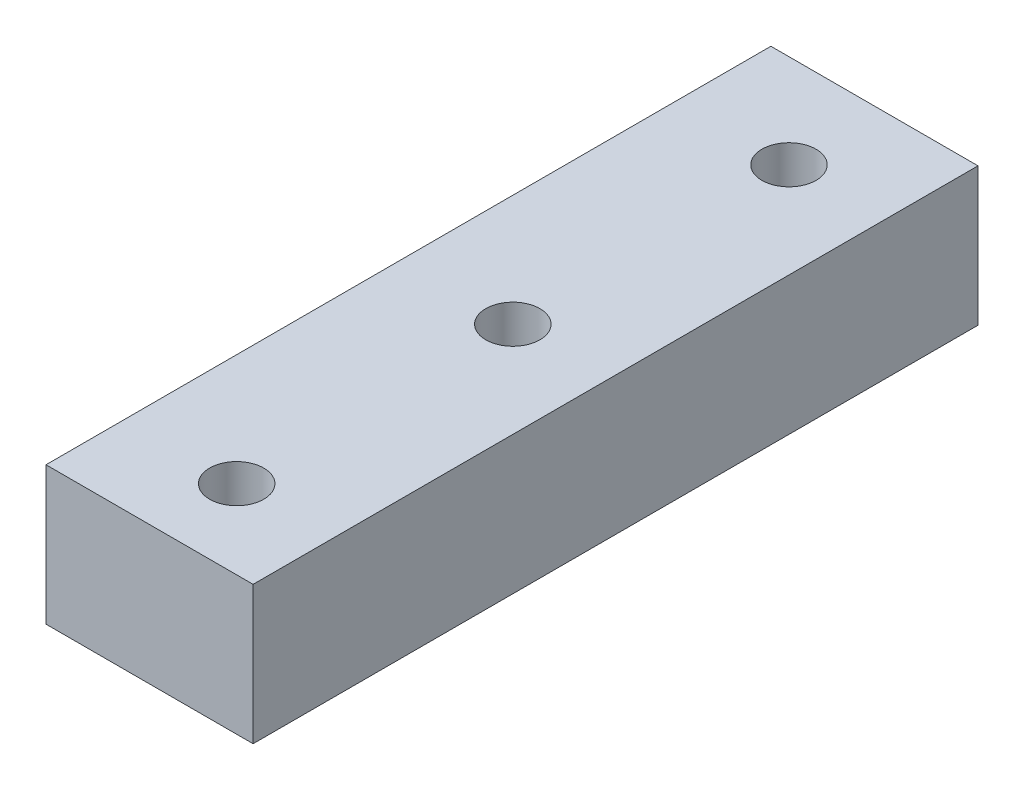
ISO-10303-21;
HEADER;
FILE_DESCRIPTION(('STEP AP214'),'2;1');
FILE_NAME('part.step','',(''),(''),'','','');
FILE_SCHEMA(('AUTOMOTIVE_DESIGN { 1 0 10303 214 1 1 1 1 }'));
ENDSEC;
DATA;
#1=APPLICATION_CONTEXT('core data for automotive mechanical design processes');
#2=APPLICATION_PROTOCOL_DEFINITION('international standard','automotive_design',2000,#1);
#3=PRODUCT_CONTEXT('',#1,'mechanical');
#4=PRODUCT('Part','Part','',(#3));
#5=PRODUCT_RELATED_PRODUCT_CATEGORY('part','',(#4));
#6=PRODUCT_DEFINITION_FORMATION('','',#4);
#7=PRODUCT_DEFINITION_CONTEXT('part definition',#1,'design');
#8=PRODUCT_DEFINITION('design','',#6,#7);
#9=PRODUCT_DEFINITION_SHAPE('','',#8);
#10=(LENGTH_UNIT() NAMED_UNIT(*) SI_UNIT(.MILLI.,.METRE.));
#11=(NAMED_UNIT(*) PLANE_ANGLE_UNIT() SI_UNIT($,.RADIAN.));
#12=(NAMED_UNIT(*) SI_UNIT($,.STERADIAN.) SOLID_ANGLE_UNIT());
#13=UNCERTAINTY_MEASURE_WITH_UNIT(LENGTH_MEASURE(1.E-05),#10,'distance_accuracy_value','');
#14=(GEOMETRIC_REPRESENTATION_CONTEXT(3) GLOBAL_UNCERTAINTY_ASSIGNED_CONTEXT((#13)) GLOBAL_UNIT_ASSIGNED_CONTEXT((#10,
#11,#12)) REPRESENTATION_CONTEXT('',''));
#15=CARTESIAN_POINT('',(0.,0.,0.));
#16=DIRECTION('',(0.,0.,1.));
#17=DIRECTION('',(1.,0.,0.));
#18=AXIS2_PLACEMENT_3D('',#15,#16,#17);
#19=CARTESIAN_POINT('',(0.,0.,0.));
#20=DIRECTION('',(0.,-1.,0.));
#21=DIRECTION('',(0.,0.,-1.));
#22=AXIS2_PLACEMENT_3D('',#19,#20,#21);
#23=PLANE('',#22);
#24=CARTESIAN_POINT('',(-61.333792588351,0.,-19.847622446318));
#25=DIRECTION('',(0.,1.,0.));
#26=DIRECTION('',(0.,0.,1.));
#27=AXIS2_PLACEMENT_3D('',#24,#25,#26);
#28=CIRCLE('',#27,2.4892);
#29=CARTESIAN_POINT('',(-61.333792588351,0.,-17.358422446318));
#30=VERTEX_POINT('',#29);
#31=EDGE_CURVE('E163',#30,#30,#28,.T.);
#32=ORIENTED_EDGE('',*,*,#31,.T.);
#33=EDGE_LOOP('',(#32));
#34=FACE_BOUND('',#33,.T.);
#35=DIRECTION('',(1.,0.,0.));
#36=VECTOR('',#35,1.);
#37=CARTESIAN_POINT('',(-71.608792588351,0.,38.2171018634932));
#38=LINE('',#37,#36);
#39=CARTESIAN_POINT('',(-71.608792588351,0.,38.2171018634932));
#40=VERTEX_POINT('',#39);
#41=CARTESIAN_POINT('',(-52.558792588351,0.,38.2171018634932));
#42=VERTEX_POINT('',#41);
#43=EDGE_CURVE('E100',#40,#42,#38,.T.);
#44=ORIENTED_EDGE('',*,*,#43,.F.);
#45=DIRECTION('',(0.,0.,1.));
#46=VECTOR('',#45,1.);
#47=CARTESIAN_POINT('',(-71.608792588351,0.,-6.23289813650677));
#48=LINE('',#47,#46);
#49=CARTESIAN_POINT('',(-71.608792588351,0.,-28.4578981365068));
#50=VERTEX_POINT('',#49);
#51=EDGE_CURVE('E120',#50,#40,#48,.T.);
#52=ORIENTED_EDGE('',*,*,#51,.F.);
#53=DIRECTION('',(-1.,0.,0.));
#54=VECTOR('',#53,1.);
#55=CARTESIAN_POINT('',(-71.608792588351,0.,-28.4578981365068));
#56=LINE('',#55,#54);
#57=CARTESIAN_POINT('',(-52.558792588351,0.,-28.4578981365068));
#58=VERTEX_POINT('',#57);
#59=EDGE_CURVE('E85',#58,#50,#56,.T.);
#60=ORIENTED_EDGE('',*,*,#59,.F.);
#61=DIRECTION('',(0.,0.,-1.));
#62=VECTOR('',#61,1.);
#63=CARTESIAN_POINT('',(-52.558792588351,0.,-28.4578981365068));
#64=LINE('',#63,#62);
#65=EDGE_CURVE('E78',#42,#58,#64,.T.);
#66=ORIENTED_EDGE('',*,*,#65,.F.);
#67=EDGE_LOOP('',(#44,#52,#60,#66));
#68=FACE_BOUND('',#67,.T.);
#69=CARTESIAN_POINT('',(-61.333792588351,0.,30.952377553682));
#70=DIRECTION('',(0.,1.,0.));
#71=DIRECTION('',(0.,0.,1.));
#72=AXIS2_PLACEMENT_3D('',#69,#70,#71);
#73=CIRCLE('',#72,2.4892);
#74=CARTESIAN_POINT('',(-61.333792588351,0.,33.441577553682));
#75=VERTEX_POINT('',#74);
#76=EDGE_CURVE('E115',#75,#75,#73,.T.);
#77=ORIENTED_EDGE('',*,*,#76,.T.);
#78=EDGE_LOOP('',(#77));
#79=FACE_BOUND('',#78,.T.);
#80=CARTESIAN_POINT('',(-61.333792588351,0.,5.55237755368201));
#81=DIRECTION('',(0.,1.,0.));
#82=DIRECTION('',(0.,0.,1.));
#83=AXIS2_PLACEMENT_3D('',#80,#81,#82);
#84=CIRCLE('',#83,2.4892);
#85=CARTESIAN_POINT('',(-61.333792588351,0.,8.041577553682));
#86=VERTEX_POINT('',#85);
#87=EDGE_CURVE('E176',#86,#86,#84,.T.);
#88=ORIENTED_EDGE('',*,*,#87,.T.);
#89=EDGE_LOOP('',(#88));
#90=FACE_BOUND('',#89,.T.);
#91=ADVANCED_FACE('F43',(#34,#68,#79,#90),#23,.T.);
#92=CARTESIAN_POINT('',(-71.608792588351,12.7,38.2171018634932));
#93=DIRECTION('',(0.,0.,-1.));
#94=DIRECTION('',(-1.,0.,0.));
#95=AXIS2_PLACEMENT_3D('',#92,#93,#94);
#96=PLANE('',#95);
#97=ORIENTED_EDGE('',*,*,#43,.T.);
#98=DIRECTION('',(0.,-1.,0.));
#99=VECTOR('',#98,1.);
#100=CARTESIAN_POINT('',(-52.558792588351,12.7,38.2171018634932));
#101=LINE('',#100,#99);
#102=CARTESIAN_POINT('',(-52.558792588351,12.7,38.2171018634932));
#103=VERTEX_POINT('',#102);
#104=EDGE_CURVE('E53',#103,#42,#101,.T.);
#105=ORIENTED_EDGE('',*,*,#104,.F.);
#106=DIRECTION('',(1.,0.,0.));
#107=VECTOR('',#106,1.);
#108=CARTESIAN_POINT('',(-71.608792588351,12.7,38.2171018634932));
#109=LINE('',#108,#107);
#110=CARTESIAN_POINT('',(-71.608792588351,12.7,38.2171018634932));
#111=VERTEX_POINT('',#110);
#112=EDGE_CURVE('E90',#111,#103,#109,.T.);
#113=ORIENTED_EDGE('',*,*,#112,.F.);
#114=DIRECTION('',(0.,-1.,0.));
#115=VECTOR('',#114,1.);
#116=CARTESIAN_POINT('',(-71.608792588351,12.7,38.2171018634932));
#117=LINE('',#116,#115);
#118=EDGE_CURVE('E11',#111,#40,#117,.T.);
#119=ORIENTED_EDGE('',*,*,#118,.T.);
#120=EDGE_LOOP('',(#97,#105,#113,#119));
#121=FACE_BOUND('',#120,.T.);
#122=ADVANCED_FACE('F45',(#121),#96,.F.);
#123=CARTESIAN_POINT('',(-52.558792588351,12.7,-28.4578981365068));
#124=DIRECTION('',(-1.,0.,0.));
#125=DIRECTION('',(0.,0.,1.));
#126=AXIS2_PLACEMENT_3D('',#123,#124,#125);
#127=PLANE('',#126);
#128=ORIENTED_EDGE('',*,*,#65,.T.);
#129=DIRECTION('',(0.,-1.,0.));
#130=VECTOR('',#129,1.);
#131=CARTESIAN_POINT('',(-52.558792588351,12.7,-28.4578981365068));
#132=LINE('',#131,#130);
#133=CARTESIAN_POINT('',(-52.558792588351,12.7,-28.4578981365068));
#134=VERTEX_POINT('',#133);
#135=EDGE_CURVE('E102',#134,#58,#132,.T.);
#136=ORIENTED_EDGE('',*,*,#135,.F.);
#137=DIRECTION('',(0.,0.,-1.));
#138=VECTOR('',#137,1.);
#139=CARTESIAN_POINT('',(-52.558792588351,12.7,12.8171018634932));
#140=LINE('',#139,#138);
#141=EDGE_CURVE('E94',#103,#134,#140,.T.);
#142=ORIENTED_EDGE('',*,*,#141,.F.);
#143=ORIENTED_EDGE('',*,*,#104,.T.);
#144=EDGE_LOOP('',(#128,#136,#142,#143));
#145=FACE_BOUND('',#144,.T.);
#146=ADVANCED_FACE('F103',(#145),#127,.F.);
#147=CARTESIAN_POINT('',(-71.608792588351,12.7,-28.4578981365068));
#148=DIRECTION('',(0.,0.,1.));
#149=DIRECTION('',(1.,0.,0.));
#150=AXIS2_PLACEMENT_3D('',#147,#148,#149);
#151=PLANE('',#150);
#152=ORIENTED_EDGE('',*,*,#59,.T.);
#153=DIRECTION('',(0.,-1.,0.));
#154=VECTOR('',#153,1.);
#155=CARTESIAN_POINT('',(-71.608792588351,12.7,-28.4578981365068));
#156=LINE('',#155,#154);
#157=CARTESIAN_POINT('',(-71.608792588351,12.7,-28.4578981365068));
#158=VERTEX_POINT('',#157);
#159=EDGE_CURVE('E109',#158,#50,#156,.T.);
#160=ORIENTED_EDGE('',*,*,#159,.F.);
#161=DIRECTION('',(-1.,0.,0.));
#162=VECTOR('',#161,1.);
#163=CARTESIAN_POINT('',(-71.608792588351,12.7,-28.4578981365068));
#164=LINE('',#163,#162);
#165=EDGE_CURVE('E106',#134,#158,#164,.T.);
#166=ORIENTED_EDGE('',*,*,#165,.F.);
#167=ORIENTED_EDGE('',*,*,#135,.T.);
#168=EDGE_LOOP('',(#152,#160,#166,#167));
#169=FACE_BOUND('',#168,.T.);
#170=ADVANCED_FACE('F126',(#169),#151,.F.);
#171=CARTESIAN_POINT('',(-71.608792588351,12.7,-6.23289813650677));
#172=DIRECTION('',(1.,0.,0.));
#173=DIRECTION('',(0.,0.,-1.));
#174=AXIS2_PLACEMENT_3D('',#171,#172,#173);
#175=PLANE('',#174);
#176=ORIENTED_EDGE('',*,*,#51,.T.);
#177=ORIENTED_EDGE('',*,*,#118,.F.);
#178=DIRECTION('',(0.,0.,1.));
#179=VECTOR('',#178,1.);
#180=CARTESIAN_POINT('',(-71.608792588351,12.7,12.8171018634932));
#181=LINE('',#180,#179);
#182=EDGE_CURVE('E61',#158,#111,#181,.T.);
#183=ORIENTED_EDGE('',*,*,#182,.F.);
#184=ORIENTED_EDGE('',*,*,#159,.T.);
#185=EDGE_LOOP('',(#176,#177,#183,#184));
#186=FACE_BOUND('',#185,.T.);
#187=ADVANCED_FACE('F130',(#186),#175,.F.);
#188=CARTESIAN_POINT('',(0.,12.7,0.));
#189=DIRECTION('',(0.,-1.,0.));
#190=DIRECTION('',(0.,0.,-1.));
#191=AXIS2_PLACEMENT_3D('',#188,#189,#190);
#192=PLANE('',#191);
#193=CARTESIAN_POINT('',(-61.333792588351,12.7,-19.847622446318));
#194=DIRECTION('',(0.,1.,0.));
#195=DIRECTION('',(0.,0.,1.));
#196=AXIS2_PLACEMENT_3D('',#193,#194,#195);
#197=CIRCLE('',#196,2.48919999999999);
#198=CARTESIAN_POINT('',(-61.333792588351,12.7,-17.358422446318));
#199=VERTEX_POINT('',#198);
#200=EDGE_CURVE('E166',#199,#199,#197,.T.);
#201=ORIENTED_EDGE('',*,*,#200,.F.);
#202=EDGE_LOOP('',(#201));
#203=FACE_BOUND('',#202,.T.);
#204=CARTESIAN_POINT('',(-61.333792588351,12.7,5.55237755368201));
#205=DIRECTION('',(0.,1.,0.));
#206=DIRECTION('',(0.,0.,1.));
#207=AXIS2_PLACEMENT_3D('',#204,#205,#206);
#208=CIRCLE('',#207,2.48919999999999);
#209=CARTESIAN_POINT('',(-61.333792588351,12.7,8.041577553682));
#210=VERTEX_POINT('',#209);
#211=EDGE_CURVE('E170',#210,#210,#208,.T.);
#212=ORIENTED_EDGE('',*,*,#211,.F.);
#213=EDGE_LOOP('',(#212));
#214=FACE_BOUND('',#213,.T.);
#215=CARTESIAN_POINT('',(-61.333792588351,12.7,30.952377553682));
#216=DIRECTION('',(0.,1.,0.));
#217=DIRECTION('',(0.,0.,1.));
#218=AXIS2_PLACEMENT_3D('',#215,#216,#217);
#219=CIRCLE('',#218,2.48919999999999);
#220=CARTESIAN_POINT('',(-61.333792588351,12.7,33.441577553682));
#221=VERTEX_POINT('',#220);
#222=EDGE_CURVE('E180',#221,#221,#219,.T.);
#223=ORIENTED_EDGE('',*,*,#222,.F.);
#224=EDGE_LOOP('',(#223));
#225=FACE_BOUND('',#224,.T.);
#226=ORIENTED_EDGE('',*,*,#182,.T.);
#227=ORIENTED_EDGE('',*,*,#112,.T.);
#228=ORIENTED_EDGE('',*,*,#141,.T.);
#229=ORIENTED_EDGE('',*,*,#165,.T.);
#230=EDGE_LOOP('',(#226,#227,#228,#229));
#231=FACE_BOUND('',#230,.T.);
#232=ADVANCED_FACE('F92',(#203,#214,#225,#231),#192,.F.);
#233=CARTESIAN_POINT('',(-61.333792588351,12.7,30.952377553682));
#234=DIRECTION('',(0.,1.,0.));
#235=DIRECTION('',(0.,0.,1.));
#236=AXIS2_PLACEMENT_3D('',#233,#234,#235);
#237=CYLINDRICAL_SURFACE('',#236,2.48919999999999);
#238=ORIENTED_EDGE('',*,*,#76,.F.);
#239=EDGE_LOOP('',(#238));
#240=FACE_BOUND('',#239,.T.);
#241=ORIENTED_EDGE('',*,*,#222,.T.);
#242=EDGE_LOOP('',(#241));
#243=FACE_BOUND('',#242,.T.);
#244=ADVANCED_FACE('F137',(#240,#243),#237,.F.);
#245=CARTESIAN_POINT('',(-61.333792588351,12.7,5.55237755368201));
#246=DIRECTION('',(0.,1.,0.));
#247=DIRECTION('',(0.,0.,1.));
#248=AXIS2_PLACEMENT_3D('',#245,#246,#247);
#249=CYLINDRICAL_SURFACE('',#248,2.48919999999999);
#250=ORIENTED_EDGE('',*,*,#87,.F.);
#251=EDGE_LOOP('',(#250));
#252=FACE_BOUND('',#251,.T.);
#253=ORIENTED_EDGE('',*,*,#211,.T.);
#254=EDGE_LOOP('',(#253));
#255=FACE_BOUND('',#254,.T.);
#256=ADVANCED_FACE('F151',(#252,#255),#249,.F.);
#257=CARTESIAN_POINT('',(-61.333792588351,12.7,-19.847622446318));
#258=DIRECTION('',(0.,1.,0.));
#259=DIRECTION('',(0.,0.,1.));
#260=AXIS2_PLACEMENT_3D('',#257,#258,#259);
#261=CYLINDRICAL_SURFACE('',#260,2.48919999999999);
#262=ORIENTED_EDGE('',*,*,#31,.F.);
#263=EDGE_LOOP('',(#262));
#264=FACE_BOUND('',#263,.T.);
#265=ORIENTED_EDGE('',*,*,#200,.T.);
#266=EDGE_LOOP('',(#265));
#267=FACE_BOUND('',#266,.T.);
#268=ADVANCED_FACE('F155',(#264,#267),#261,.F.);
#269=CLOSED_SHELL('',(#91,#122,#146,#170,#187,#232,#244,#256,#268));
#270=MANIFOLD_SOLID_BREP('B2',#269);
#271=ADVANCED_BREP_SHAPE_REPRESENTATION('',(#18,#270),#14);
#272=SHAPE_DEFINITION_REPRESENTATION(#9,#271);
ENDSEC;
END-ISO-10303-21;
